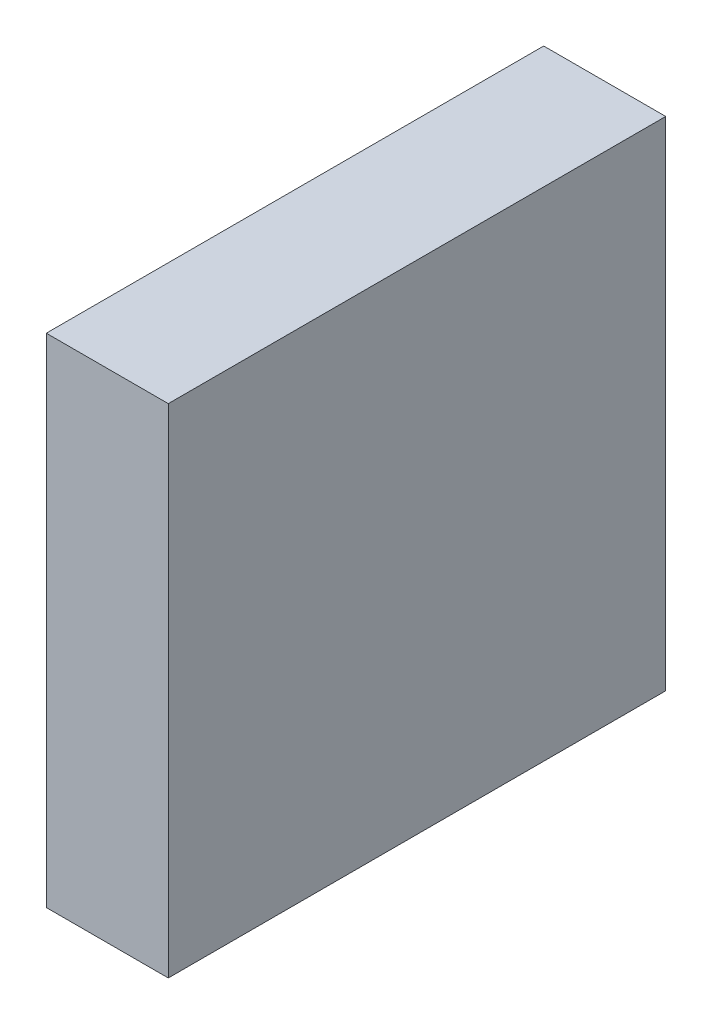
ISO-10303-21;
HEADER;
FILE_DESCRIPTION(('STEP AP214'),'2;1');
FILE_NAME('part.step','',(''),(''),'','','');
FILE_SCHEMA(('AUTOMOTIVE_DESIGN { 1 0 10303 214 1 1 1 1 }'));
ENDSEC;
DATA;
#1=APPLICATION_CONTEXT('core data for automotive mechanical design processes');
#2=APPLICATION_PROTOCOL_DEFINITION('international standard','automotive_design',2000,#1);
#3=PRODUCT_CONTEXT('',#1,'mechanical');
#4=PRODUCT('Part','Part','',(#3));
#5=PRODUCT_RELATED_PRODUCT_CATEGORY('part','',(#4));
#6=PRODUCT_DEFINITION_FORMATION('','',#4);
#7=PRODUCT_DEFINITION_CONTEXT('part definition',#1,'design');
#8=PRODUCT_DEFINITION('design','',#6,#7);
#9=PRODUCT_DEFINITION_SHAPE('','',#8);
#10=(LENGTH_UNIT() NAMED_UNIT(*) SI_UNIT(.MILLI.,.METRE.));
#11=(NAMED_UNIT(*) PLANE_ANGLE_UNIT() SI_UNIT($,.RADIAN.));
#12=(NAMED_UNIT(*) SI_UNIT($,.STERADIAN.) SOLID_ANGLE_UNIT());
#13=UNCERTAINTY_MEASURE_WITH_UNIT(LENGTH_MEASURE(1.E-05),#10,'distance_accuracy_value','');
#14=(GEOMETRIC_REPRESENTATION_CONTEXT(3) GLOBAL_UNCERTAINTY_ASSIGNED_CONTEXT((#13)) GLOBAL_UNIT_ASSIGNED_CONTEXT((#10,
#11,#12)) REPRESENTATION_CONTEXT('',''));
#15=CARTESIAN_POINT('',(0.,0.,0.));
#16=DIRECTION('',(0.,0.,1.));
#17=DIRECTION('',(1.,0.,0.));
#18=AXIS2_PLACEMENT_3D('',#15,#16,#17);
#19=CARTESIAN_POINT('',(13.,0.,0.));
#20=DIRECTION('',(0.,0.,1.));
#21=DIRECTION('',(0.,-1.,0.));
#22=AXIS2_PLACEMENT_3D('',#19,#20,#21);
#23=PLANE('',#22);
#24=DIRECTION('',(0.,1.,0.));
#25=VECTOR('',#24,1.);
#26=CARTESIAN_POINT('',(0.,0.,0.));
#27=LINE('',#26,#25);
#28=CARTESIAN_POINT('',(0.,-53.,0.));
#29=VERTEX_POINT('',#28);
#30=CARTESIAN_POINT('',(0.,0.,0.));
#31=VERTEX_POINT('',#30);
#32=EDGE_CURVE('E107',#29,#31,#27,.T.);
#33=ORIENTED_EDGE('',*,*,#32,.T.);
#34=DIRECTION('',(-1.,0.,0.));
#35=VECTOR('',#34,1.);
#36=CARTESIAN_POINT('',(13.,0.,0.));
#37=LINE('',#36,#35);
#38=CARTESIAN_POINT('',(13.,0.,0.));
#39=VERTEX_POINT('',#38);
#40=EDGE_CURVE('E11',#39,#31,#37,.T.);
#41=ORIENTED_EDGE('',*,*,#40,.F.);
#42=DIRECTION('',(0.,1.,0.));
#43=VECTOR('',#42,1.);
#44=CARTESIAN_POINT('',(13.,0.,0.));
#45=LINE('',#44,#43);
#46=CARTESIAN_POINT('',(13.,-53.,0.));
#47=VERTEX_POINT('',#46);
#48=EDGE_CURVE('E91',#47,#39,#45,.T.);
#49=ORIENTED_EDGE('',*,*,#48,.F.);
#50=DIRECTION('',(-1.,0.,0.));
#51=VECTOR('',#50,1.);
#52=CARTESIAN_POINT('',(13.,-53.,0.));
#53=LINE('',#52,#51);
#54=EDGE_CURVE('E103',#47,#29,#53,.T.);
#55=ORIENTED_EDGE('',*,*,#54,.T.);
#56=EDGE_LOOP('',(#33,#41,#49,#55));
#57=FACE_BOUND('',#56,.T.);
#58=ADVANCED_FACE('F39',(#57),#23,.F.);
#59=CARTESIAN_POINT('',(13.,0.,0.));
#60=DIRECTION('',(0.,-1.,0.));
#61=DIRECTION('',(0.,0.,-1.));
#62=AXIS2_PLACEMENT_3D('',#59,#60,#61);
#63=PLANE('',#62);
#64=DIRECTION('',(0.,0.,1.));
#65=VECTOR('',#64,1.);
#66=CARTESIAN_POINT('',(0.,0.,0.));
#67=LINE('',#66,#65);
#68=CARTESIAN_POINT('',(0.,0.,53.));
#69=VERTEX_POINT('',#68);
#70=EDGE_CURVE('E96',#31,#69,#67,.T.);
#71=ORIENTED_EDGE('',*,*,#70,.T.);
#72=DIRECTION('',(-1.,0.,0.));
#73=VECTOR('',#72,1.);
#74=CARTESIAN_POINT('',(13.,0.,53.));
#75=LINE('',#74,#73);
#76=CARTESIAN_POINT('',(13.,0.,53.));
#77=VERTEX_POINT('',#76);
#78=EDGE_CURVE('E48',#77,#69,#75,.T.);
#79=ORIENTED_EDGE('',*,*,#78,.F.);
#80=DIRECTION('',(0.,0.,1.));
#81=VECTOR('',#80,1.);
#82=CARTESIAN_POINT('',(13.,0.,0.));
#83=LINE('',#82,#81);
#84=EDGE_CURVE('E86',#39,#77,#83,.T.);
#85=ORIENTED_EDGE('',*,*,#84,.F.);
#86=ORIENTED_EDGE('',*,*,#40,.T.);
#87=EDGE_LOOP('',(#71,#79,#85,#86));
#88=FACE_BOUND('',#87,.T.);
#89=ADVANCED_FACE('F95',(#88),#63,.F.);
#90=CARTESIAN_POINT('',(13.,0.,53.));
#91=DIRECTION('',(0.,0.,-1.));
#92=DIRECTION('',(-1.,0.,0.));
#93=AXIS2_PLACEMENT_3D('',#90,#91,#92);
#94=PLANE('',#93);
#95=DIRECTION('',(0.,-1.,0.));
#96=VECTOR('',#95,1.);
#97=CARTESIAN_POINT('',(0.,0.,53.));
#98=LINE('',#97,#96);
#99=CARTESIAN_POINT('',(0.,-53.,53.));
#100=VERTEX_POINT('',#99);
#101=EDGE_CURVE('E73',#69,#100,#98,.T.);
#102=ORIENTED_EDGE('',*,*,#101,.T.);
#103=DIRECTION('',(-1.,0.,0.));
#104=VECTOR('',#103,1.);
#105=CARTESIAN_POINT('',(13.,-53.,53.));
#106=LINE('',#105,#104);
#107=CARTESIAN_POINT('',(13.,-53.,53.));
#108=VERTEX_POINT('',#107);
#109=EDGE_CURVE('E98',#108,#100,#106,.T.);
#110=ORIENTED_EDGE('',*,*,#109,.F.);
#111=DIRECTION('',(0.,-1.,0.));
#112=VECTOR('',#111,1.);
#113=CARTESIAN_POINT('',(13.,0.,53.));
#114=LINE('',#113,#112);
#115=EDGE_CURVE('E89',#77,#108,#114,.T.);
#116=ORIENTED_EDGE('',*,*,#115,.F.);
#117=ORIENTED_EDGE('',*,*,#78,.T.);
#118=EDGE_LOOP('',(#102,#110,#116,#117));
#119=FACE_BOUND('',#118,.T.);
#120=ADVANCED_FACE('F99',(#119),#94,.F.);
#121=CARTESIAN_POINT('',(13.,-53.,0.));
#122=DIRECTION('',(0.,1.,0.));
#123=DIRECTION('',(0.,0.,1.));
#124=AXIS2_PLACEMENT_3D('',#121,#122,#123);
#125=PLANE('',#124);
#126=DIRECTION('',(0.,0.,-1.));
#127=VECTOR('',#126,1.);
#128=CARTESIAN_POINT('',(0.,-53.,0.));
#129=LINE('',#128,#127);
#130=EDGE_CURVE('E79',#100,#29,#129,.T.);
#131=ORIENTED_EDGE('',*,*,#130,.T.);
#132=ORIENTED_EDGE('',*,*,#54,.F.);
#133=DIRECTION('',(0.,0.,-1.));
#134=VECTOR('',#133,1.);
#135=CARTESIAN_POINT('',(13.,-53.,0.));
#136=LINE('',#135,#134);
#137=EDGE_CURVE('E56',#108,#47,#136,.T.);
#138=ORIENTED_EDGE('',*,*,#137,.F.);
#139=ORIENTED_EDGE('',*,*,#109,.T.);
#140=EDGE_LOOP('',(#131,#132,#138,#139));
#141=FACE_BOUND('',#140,.T.);
#142=ADVANCED_FACE('F120',(#141),#125,.F.);
#143=CARTESIAN_POINT('',(13.,0.,0.));
#144=DIRECTION('',(-1.,0.,0.));
#145=DIRECTION('',(0.,0.,1.));
#146=AXIS2_PLACEMENT_3D('',#143,#144,#145);
#147=PLANE('',#146);
#148=ORIENTED_EDGE('',*,*,#48,.T.);
#149=ORIENTED_EDGE('',*,*,#84,.T.);
#150=ORIENTED_EDGE('',*,*,#115,.T.);
#151=ORIENTED_EDGE('',*,*,#137,.T.);
#152=EDGE_LOOP('',(#148,#149,#150,#151));
#153=FACE_BOUND('',#152,.T.);
#154=ADVANCED_FACE('F87',(#153),#147,.F.);
#155=CARTESIAN_POINT('',(0.,0.,0.));
#156=DIRECTION('',(-1.,0.,0.));
#157=DIRECTION('',(0.,0.,1.));
#158=AXIS2_PLACEMENT_3D('',#155,#156,#157);
#159=PLANE('',#158);
#160=ORIENTED_EDGE('',*,*,#32,.F.);
#161=ORIENTED_EDGE('',*,*,#130,.F.);
#162=ORIENTED_EDGE('',*,*,#101,.F.);
#163=ORIENTED_EDGE('',*,*,#70,.F.);
#164=EDGE_LOOP('',(#160,#161,#162,#163));
#165=FACE_BOUND('',#164,.T.);
#166=ADVANCED_FACE('F123',(#165),#159,.T.);
#167=CLOSED_SHELL('',(#58,#89,#120,#142,#154,#166));
#168=MANIFOLD_SOLID_BREP('B2',#167);
#169=ADVANCED_BREP_SHAPE_REPRESENTATION('',(#18,#168),#14);
#170=SHAPE_DEFINITION_REPRESENTATION(#9,#169);
ENDSEC;
END-ISO-10303-21;
